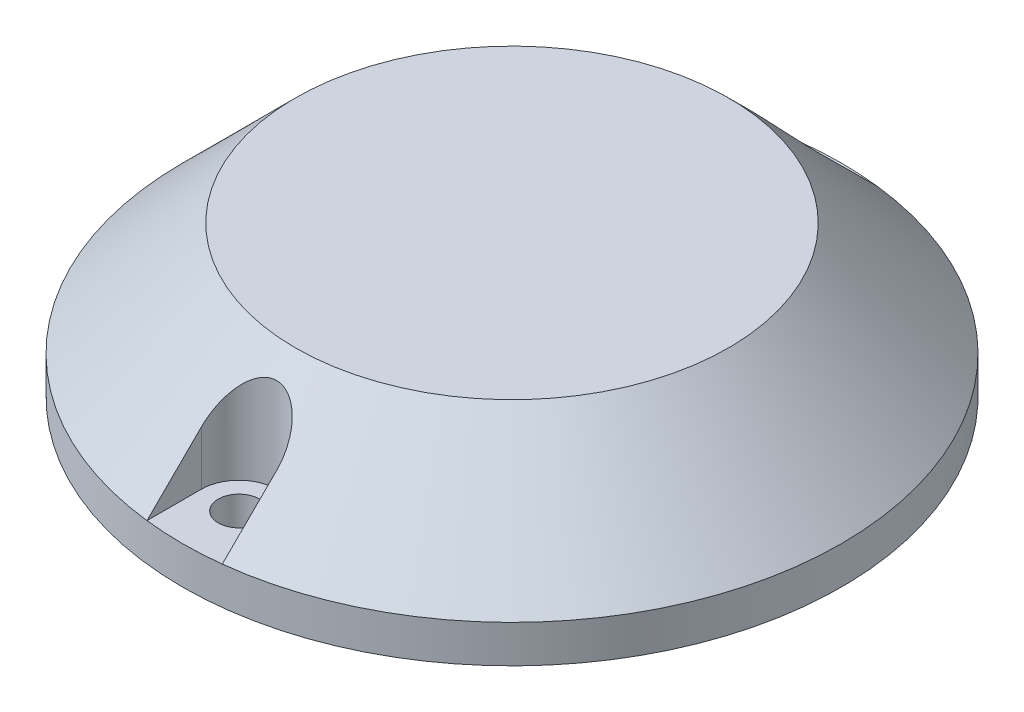
ISO-10303-21;
HEADER;
FILE_DESCRIPTION(('STEP AP214'),'2;1');
FILE_NAME('part.step','',(''),(''),'','','');
FILE_SCHEMA(('AUTOMOTIVE_DESIGN { 1 0 10303 214 1 1 1 1 }'));
ENDSEC;
DATA;
#1=APPLICATION_CONTEXT('core data for automotive mechanical design processes');
#2=APPLICATION_PROTOCOL_DEFINITION('international standard','automotive_design',2000,#1);
#3=PRODUCT_CONTEXT('',#1,'mechanical');
#4=PRODUCT('Part','Part','',(#3));
#5=PRODUCT_RELATED_PRODUCT_CATEGORY('part','',(#4));
#6=PRODUCT_DEFINITION_FORMATION('','',#4);
#7=PRODUCT_DEFINITION_CONTEXT('part definition',#1,'design');
#8=PRODUCT_DEFINITION('design','',#6,#7);
#9=PRODUCT_DEFINITION_SHAPE('','',#8);
#10=(LENGTH_UNIT() NAMED_UNIT(*) SI_UNIT(.MILLI.,.METRE.));
#11=(NAMED_UNIT(*) PLANE_ANGLE_UNIT() SI_UNIT($,.RADIAN.));
#12=(NAMED_UNIT(*) SI_UNIT($,.STERADIAN.) SOLID_ANGLE_UNIT());
#13=UNCERTAINTY_MEASURE_WITH_UNIT(LENGTH_MEASURE(1.E-05),#10,'distance_accuracy_value','');
#14=(GEOMETRIC_REPRESENTATION_CONTEXT(3) GLOBAL_UNCERTAINTY_ASSIGNED_CONTEXT((#13)) GLOBAL_UNIT_ASSIGNED_CONTEXT((#10,
#11,#12)) REPRESENTATION_CONTEXT('',''));
#15=CARTESIAN_POINT('',(0.,0.,0.));
#16=DIRECTION('',(0.,0.,1.));
#17=DIRECTION('',(1.,0.,0.));
#18=AXIS2_PLACEMENT_3D('',#15,#16,#17);
#19=CARTESIAN_POINT('',(0.,2.,14.5));
#20=DIRECTION('',(0.,-1.,0.));
#21=DIRECTION('',(0.,0.,-1.));
#22=AXIS2_PLACEMENT_3D('',#19,#20,#21);
#23=CYLINDRICAL_SURFACE('',#22,2.);
#24=CARTESIAN_POINT('',(0.,2.,14.5));
#25=DIRECTION('',(0.,-1.,0.));
#26=DIRECTION('',(0.,0.,-1.));
#27=AXIS2_PLACEMENT_3D('',#24,#25,#26);
#28=CIRCLE('',#27,2.);
#29=CARTESIAN_POINT('',(2.,2.,14.5));
#30=VERTEX_POINT('',#29);
#31=CARTESIAN_POINT('',(-2.,2.,14.5));
#32=VERTEX_POINT('',#31);
#33=EDGE_CURVE('E55',#30,#32,#28,.F.);
#34=ORIENTED_EDGE('',*,*,#33,.F.);
#35=DIRECTION('',(0.,-1.,0.));
#36=VECTOR('',#35,1.);
#37=CARTESIAN_POINT('',(2.,2.,14.5));
#38=LINE('',#37,#36);
#39=CARTESIAN_POINT('',(2.,4.86271883169562,14.5));
#40=VERTEX_POINT('',#39);
#41=EDGE_CURVE('E99',#40,#30,#38,.T.);
#42=ORIENTED_EDGE('',*,*,#41,.F.);
#43=CARTESIAN_POINT('',(2.,4.86271883169562,14.5));
#44=CARTESIAN_POINT('',(1.99997675343329,4.9407063679277,14.4212679489537));
#45=CARTESIAN_POINT('',(1.99535023705728,5.01901098737155,14.3428571380048));
#46=CARTESIAN_POINT('',(1.97694116800539,5.17578227500736,14.1871417479179));
#47=CARTESIAN_POINT('',(1.96315053181912,5.25424902524117,14.1098382070366));
#48=CARTESIAN_POINT('',(1.92628875434578,5.41148013636709,13.9562118483707));
#49=CARTESIAN_POINT('',(1.9031302247794,5.49024018078634,13.8799054514541));
#50=CARTESIAN_POINT('',(1.84742995490291,5.64661207060306,13.7296635568936));
#51=CARTESIAN_POINT('',(1.81489261304049,5.72422443633957,13.6557269658848));
#52=CARTESIAN_POINT('',(1.72278488749495,5.91328422099697,13.4771124547483));
#53=CARTESIAN_POINT('',(1.65767854615705,6.02369487984886,13.3741151805785));
#54=CARTESIAN_POINT('',(1.50542969733379,6.2369744024634,13.1774676947132));
#55=CARTESIAN_POINT('',(1.41836291824915,6.33986764793458,13.083786873342));
#56=CARTESIAN_POINT('',(1.25146131262373,6.50243323060851,12.937322221444));
#57=CARTESIAN_POINT('',(1.1780557708533,6.56547952830184,12.8809773757641));
#58=CARTESIAN_POINT('',(1.01931178866978,6.68298970102627,12.7766318825946));
#59=CARTESIAN_POINT('',(0.93398971376953,6.73746513223485,12.728619990536));
#60=CARTESIAN_POINT('',(0.772400968920876,6.82308865136111,12.6535405405875));
#61=CARTESIAN_POINT('',(0.698526214854478,6.85672242454555,12.6241942203136));
#62=CARTESIAN_POINT('',(0.544471315504831,6.91460573684364,12.5738382408308));
#63=CARTESIAN_POINT('',(0.464296218293099,6.93886269859673,12.5528219872452));
#64=CARTESIAN_POINT('',(0.298595863160995,6.97610959645531,12.5206024046663));
#65=CARTESIAN_POINT('',(0.213028899800128,6.98899602015913,12.5094892200129));
#66=CARTESIAN_POINT('',(0.0402300532613766,7.0016960635457,12.4985363398051));
#67=CARTESIAN_POINT('',(-0.0470005159210861,7.00151960553767,12.4986880876287));
#68=CARTESIAN_POINT('',(-0.207779439783227,6.9890796478216,12.5094174519238));
#69=CARTESIAN_POINT('',(-0.281564386338052,6.97847614552241,12.5185632200418));
#70=CARTESIAN_POINT('',(-0.425914432295378,6.94847760521361,12.5444996802881));
#71=CARTESIAN_POINT('',(-0.496478029268296,6.92907851015147,12.5612939003551));
#72=CARTESIAN_POINT('',(-0.653948767606214,6.87570769293482,12.6076501204024));
#73=CARTESIAN_POINT('',(-0.73926858946657,6.83909510996504,12.6395447575344));
#74=CARTESIAN_POINT('',(-0.900919440127082,6.75616004782281,12.7121976647588));
#75=CARTESIAN_POINT('',(-0.977233474591019,6.70981965547488,12.7529722920796));
#76=CARTESIAN_POINT('',(-1.15085918589485,6.58904592064706,12.8599224200133));
#77=CARTESIAN_POINT('',(-1.2434946113421,6.51099641084536,12.9295667574945));
#78=CARTESIAN_POINT('',(-1.41132920262807,6.34583074258239,13.078458869032));
#79=CARTESIAN_POINT('',(-1.48649058136265,6.25869551479957,13.1577269012111));
#80=CARTESIAN_POINT('',(-1.60114526282088,6.10487053072235,13.2991515358176));
#81=CARTESIAN_POINT('',(-1.6446650484717,6.03956513683104,13.3596179427855));
#82=CARTESIAN_POINT('',(-1.7239109204794,5.90690701820365,13.483371175306));
#83=CARTESIAN_POINT('',(-1.75963343421724,5.83955337101723,13.5466592778002));
#84=CARTESIAN_POINT('',(-1.85553143370052,5.63542310121361,13.7399337644359));
#85=CARTESIAN_POINT('',(-1.90449527879017,5.49649673749924,13.8734040790472));
#86=CARTESIAN_POINT('',(-1.9592696849247,5.27447768269675,14.0899528129197));
#87=CARTESIAN_POINT('',(-1.974540629402,5.1918152905621,14.1712874921419));
#88=CARTESIAN_POINT('',(-1.9948674393182,5.02690853588058,14.3349514420268));
#89=CARTESIAN_POINT('',(-1.9999657136124,4.94466386964872,14.4172751380618));
#90=CARTESIAN_POINT('',(-2.,4.86271883169562,14.5));
#91=B_SPLINE_CURVE_WITH_KNOTS('',3,(#43,#44,#45,#46,#47,#48,#49,#50,#51,#52,#53,#54,#55,#56,#57,
#58,#59,#60,#61,#62,#63,#64,#65,#66,#67,#68,#69,#70,#71,#72,#73,#74,#75,#76,#77,#78,#79,#80,#81,
#82,#83,#84,#85,#86,#87,#88,#89,#90),.UNSPECIFIED.,.F.,.F.,(4,2,2,2,2,2,2,2,2,2,2,2,2,2,2,2,2,2,
2,2,2,2,2,4),(0.,0.332352777438069,0.6649991073055,1.00082284399915,1.33648934259785,
1.82813850619722,2.31811490768561,2.65304936764591,2.98752828914008,3.24550934086806,
3.50328575577157,3.76338533783269,4.02328735537175,4.24756650352392,4.47194920801936,
4.76483515937641,5.05826524941971,5.47516346985609,5.89295500443999,6.18978891190359,
6.48675854102625,7.08033154594792,7.43086108173531,7.77992621562889),.UNSPECIFIED.);
#92=CARTESIAN_POINT('',(-2.,4.86271883169562,14.5));
#93=VERTEX_POINT('',#92);
#94=EDGE_CURVE('E113',#40,#93,#91,.T.);
#95=ORIENTED_EDGE('',*,*,#94,.T.);
#96=DIRECTION('',(0.,-1.,0.));
#97=VECTOR('',#96,1.);
#98=CARTESIAN_POINT('',(-2.,2.,14.5));
#99=LINE('',#98,#97);
#100=EDGE_CURVE('E148',#93,#32,#99,.T.);
#101=ORIENTED_EDGE('',*,*,#100,.T.);
#102=EDGE_LOOP('',(#34,#42,#95,#101));
#103=FACE_BOUND('',#102,.T.);
#104=ADVANCED_FACE('F39',(#103),#23,.F.);
#105=CARTESIAN_POINT('',(2.,2.,14.5));
#106=DIRECTION('',(1.,0.,0.));
#107=DIRECTION('',(0.,0.,-1.));
#108=AXIS2_PLACEMENT_3D('',#105,#106,#107);
#109=PLANE('',#108);
#110=DIRECTION('',(0.,0.,-1.));
#111=VECTOR('',#110,1.);
#112=CARTESIAN_POINT('',(2.,2.,14.5));
#113=LINE('',#112,#111);
#114=CARTESIAN_POINT('',(2.,2.,17.3853386507137));
#115=VERTEX_POINT('',#114);
#116=EDGE_CURVE('E94',#115,#30,#113,.T.);
#117=ORIENTED_EDGE('',*,*,#116,.F.);
#118=CARTESIAN_POINT('',(2.,2.,17.3853386507138));
#119=CARTESIAN_POINT('',(2.,2.23871552726578,17.1450482090425));
#120=CARTESIAN_POINT('',(2.,2.47739903699564,16.9047259539619));
#121=CARTESIAN_POINT('',(2.,2.95469205096368,16.4240080263002));
#122=CARTESIAN_POINT('',(2.,3.19330155521112,16.1836123537283));
#123=CARTESIAN_POINT('',(2.,3.6704366548449,15.7027377329102));
#124=CARTESIAN_POINT('',(2.,3.90896225022867,15.4622587846613));
#125=CARTESIAN_POINT('',(2.,4.38591650893731,14.9812047241831));
#126=CARTESIAN_POINT('',(2.,4.62434517225003,14.7406296119417));
#127=CARTESIAN_POINT('',(2.,4.86271883169562,14.5));
#128=B_SPLINE_CURVE_WITH_KNOTS('',3,(#118,#119,#120,#121,#122,#123,#124,#125,#126,#127),
.UNSPECIFIED.,.F.,.F.,(4,2,2,2,4),(0.,1.01613060158689,2.0322610760301,3.0483915815947,
4.0645222144758),.UNSPECIFIED.);
#129=EDGE_CURVE('E97',#115,#40,#128,.T.);
#130=ORIENTED_EDGE('',*,*,#129,.T.);
#131=ORIENTED_EDGE('',*,*,#41,.T.);
#132=EDGE_LOOP('',(#117,#130,#131));
#133=FACE_BOUND('',#132,.T.);
#134=ADVANCED_FACE('F96',(#133),#109,.F.);
#135=CARTESIAN_POINT('',(2.,2.,-14.5));
#136=DIRECTION('',(1.,0.,0.));
#137=DIRECTION('',(0.,0.,-1.));
#138=AXIS2_PLACEMENT_3D('',#135,#136,#137);
#139=PLANE('',#138);
#140=DIRECTION('',(0.,0.,-1.));
#141=VECTOR('',#140,1.);
#142=CARTESIAN_POINT('',(2.,2.,-14.5));
#143=LINE('',#142,#141);
#144=CARTESIAN_POINT('',(2.,2.,-14.5));
#145=VERTEX_POINT('',#144);
#146=CARTESIAN_POINT('',(2.,2.,-17.3853386507137));
#147=VERTEX_POINT('',#146);
#148=EDGE_CURVE('E63',#145,#147,#143,.T.);
#149=ORIENTED_EDGE('',*,*,#148,.F.);
#150=DIRECTION('',(0.,-1.,0.));
#151=VECTOR('',#150,1.);
#152=CARTESIAN_POINT('',(2.,2.,-14.5));
#153=LINE('',#152,#151);
#154=CARTESIAN_POINT('',(2.,4.86271883169562,-14.5));
#155=VERTEX_POINT('',#154);
#156=EDGE_CURVE('E155',#155,#145,#153,.T.);
#157=ORIENTED_EDGE('',*,*,#156,.F.);
#158=CARTESIAN_POINT('',(2.,4.86271883169562,-14.5));
#159=CARTESIAN_POINT('',(2.,4.62434517225003,-14.7406296119417));
#160=CARTESIAN_POINT('',(2.,4.38591650893731,-14.9812047241831));
#161=CARTESIAN_POINT('',(2.,3.90896225022867,-15.4622587846613));
#162=CARTESIAN_POINT('',(2.,3.6704366548449,-15.7027377329102));
#163=CARTESIAN_POINT('',(2.,3.19330155521112,-16.1836123537283));
#164=CARTESIAN_POINT('',(2.,2.95469205096368,-16.4240080263002));
#165=CARTESIAN_POINT('',(2.,2.47739903699564,-16.9047259539619));
#166=CARTESIAN_POINT('',(2.,2.23871552726578,-17.1450482090425));
#167=CARTESIAN_POINT('',(2.,2.,-17.3853386507138));
#168=B_SPLINE_CURVE_WITH_KNOTS('',3,(#158,#159,#160,#161,#162,#163,#164,#165,#166,#167),
.UNSPECIFIED.,.F.,.F.,(4,2,2,2,4),(0.,1.0161306328811,2.03226113844571,3.04839161288891,
4.0645222144758),.UNSPECIFIED.);
#169=EDGE_CURVE('E209',#155,#147,#168,.T.);
#170=ORIENTED_EDGE('',*,*,#169,.T.);
#171=EDGE_LOOP('',(#149,#157,#170));
#172=FACE_BOUND('',#171,.T.);
#173=ADVANCED_FACE('F219',(#172),#139,.F.);
#174=CARTESIAN_POINT('',(0.,2.,-14.5));
#175=DIRECTION('',(0.,-1.,0.));
#176=DIRECTION('',(0.,0.,-1.));
#177=AXIS2_PLACEMENT_3D('',#174,#175,#176);
#178=CYLINDRICAL_SURFACE('',#177,2.);
#179=CARTESIAN_POINT('',(0.,2.,-14.5));
#180=DIRECTION('',(0.,-1.,0.));
#181=DIRECTION('',(0.,0.,-1.));
#182=AXIS2_PLACEMENT_3D('',#179,#180,#181);
#183=CIRCLE('',#182,2.);
#184=CARTESIAN_POINT('',(-2.,2.,-14.5));
#185=VERTEX_POINT('',#184);
#186=EDGE_CURVE('E139',#185,#145,#183,.F.);
#187=ORIENTED_EDGE('',*,*,#186,.F.);
#188=DIRECTION('',(0.,-1.,0.));
#189=VECTOR('',#188,1.);
#190=CARTESIAN_POINT('',(-2.,2.,-14.5));
#191=LINE('',#190,#189);
#192=CARTESIAN_POINT('',(-2.,4.86271883169562,-14.5));
#193=VERTEX_POINT('',#192);
#194=EDGE_CURVE('E152',#193,#185,#191,.T.);
#195=ORIENTED_EDGE('',*,*,#194,.F.);
#196=CARTESIAN_POINT('',(-2.,4.86271883169562,-14.5));
#197=CARTESIAN_POINT('',(-1.99997675343329,4.9407063679277,-14.4212679489537));
#198=CARTESIAN_POINT('',(-1.99535023705728,5.01901098737155,-14.3428571380048));
#199=CARTESIAN_POINT('',(-1.97694116800539,5.17578227500736,-14.1871417479179));
#200=CARTESIAN_POINT('',(-1.96315053181912,5.25424902524117,-14.1098382070366));
#201=CARTESIAN_POINT('',(-1.92628875434578,5.41148013636709,-13.9562118483707));
#202=CARTESIAN_POINT('',(-1.9031302247794,5.49024018078634,-13.8799054514541));
#203=CARTESIAN_POINT('',(-1.84742995490291,5.64661207060306,-13.7296635568936));
#204=CARTESIAN_POINT('',(-1.81489261304049,5.72422443633957,-13.6557269658848));
#205=CARTESIAN_POINT('',(-1.72278488749495,5.91328422099697,-13.4771124547483));
#206=CARTESIAN_POINT('',(-1.65767854615705,6.02369487984886,-13.3741151805785));
#207=CARTESIAN_POINT('',(-1.50542969733379,6.2369744024634,-13.1774676947132));
#208=CARTESIAN_POINT('',(-1.41836291824915,6.33986764793458,-13.083786873342));
#209=CARTESIAN_POINT('',(-1.25146131262373,6.50243323060851,-12.937322221444));
#210=CARTESIAN_POINT('',(-1.1780557708533,6.56547952830184,-12.8809773757641));
#211=CARTESIAN_POINT('',(-1.01931178866978,6.68298970102627,-12.7766318825946));
#212=CARTESIAN_POINT('',(-0.93398971376953,6.73746513223485,-12.728619990536));
#213=CARTESIAN_POINT('',(-0.772400968920876,6.82308865136111,-12.6535405405875));
#214=CARTESIAN_POINT('',(-0.698526214854478,6.85672242454555,-12.6241942203136));
#215=CARTESIAN_POINT('',(-0.544471315504831,6.91460573684364,-12.5738382408308));
#216=CARTESIAN_POINT('',(-0.464296218293099,6.93886269859673,-12.5528219872452));
#217=CARTESIAN_POINT('',(-0.298595863160995,6.97610959645531,-12.5206024046663));
#218=CARTESIAN_POINT('',(-0.213028899800128,6.98899602015913,-12.5094892200129));
#219=CARTESIAN_POINT('',(-0.0402300532613766,7.0016960635457,-12.4985363398051));
#220=CARTESIAN_POINT('',(0.0470005159210861,7.00151960553767,-12.4986880876287));
#221=CARTESIAN_POINT('',(0.207779439783227,6.9890796478216,-12.5094174519238));
#222=CARTESIAN_POINT('',(0.281564386338052,6.97847614552241,-12.5185632200418));
#223=CARTESIAN_POINT('',(0.425914432295378,6.94847760521361,-12.5444996802881));
#224=CARTESIAN_POINT('',(0.496478029268296,6.92907851015147,-12.5612939003551));
#225=CARTESIAN_POINT('',(0.653948767606214,6.87570769293482,-12.6076501204024));
#226=CARTESIAN_POINT('',(0.73926858946657,6.83909510996504,-12.6395447575344));
#227=CARTESIAN_POINT('',(0.900919440127082,6.75616004782281,-12.7121976647588));
#228=CARTESIAN_POINT('',(0.977233474591019,6.70981965547488,-12.7529722920796));
#229=CARTESIAN_POINT('',(1.15085918589485,6.58904592064706,-12.8599224200133));
#230=CARTESIAN_POINT('',(1.2434946113421,6.51099641084536,-12.9295667574945));
#231=CARTESIAN_POINT('',(1.41132920262807,6.34583074258239,-13.078458869032));
#232=CARTESIAN_POINT('',(1.48649058136265,6.25869551479957,-13.1577269012111));
#233=CARTESIAN_POINT('',(1.60114526282088,6.10487053072235,-13.2991515358176));
#234=CARTESIAN_POINT('',(1.6446650484717,6.03956513683104,-13.3596179427855));
#235=CARTESIAN_POINT('',(1.7239109204794,5.90690701820365,-13.483371175306));
#236=CARTESIAN_POINT('',(1.75963343421724,5.83955337101723,-13.5466592778002));
#237=CARTESIAN_POINT('',(1.85553143370052,5.63542310121361,-13.7399337644359));
#238=CARTESIAN_POINT('',(1.90449527879017,5.49649673749924,-13.8734040790472));
#239=CARTESIAN_POINT('',(1.9592696849247,5.27447768269675,-14.0899528129197));
#240=CARTESIAN_POINT('',(1.974540629402,5.1918152905621,-14.1712874921419));
#241=CARTESIAN_POINT('',(1.9948674393182,5.02690853588058,-14.3349514420268));
#242=CARTESIAN_POINT('',(1.9999657136124,4.94466386964872,-14.4172751380618));
#243=CARTESIAN_POINT('',(2.,4.86271883169562,-14.5));
#244=B_SPLINE_CURVE_WITH_KNOTS('',3,(#196,#197,#198,#199,#200,#201,#202,#203,#204,#205,#206,
#207,#208,#209,#210,#211,#212,#213,#214,#215,#216,#217,#218,#219,#220,#221,#222,#223,#224,#225,
#226,#227,#228,#229,#230,#231,#232,#233,#234,#235,#236,#237,#238,#239,#240,#241,#242,#243),
.UNSPECIFIED.,.F.,.F.,(4,2,2,2,2,2,2,2,2,2,2,2,2,2,2,2,2,2,2,2,2,2,2,4),(0.,0.332352777438069,
0.6649991073055,1.00082284399915,1.33648934259785,1.82813850619722,2.31811490768561,
2.65304936764591,2.98752828914008,3.24550934086806,3.50328575577157,3.76338533783269,
4.02328735537175,4.24756650352392,4.47194920801936,4.76483515937641,5.05826524941971,
5.47516346985609,5.89295500443999,6.18978891190359,6.48675854102625,7.08033154594792,
7.43086108173531,7.77992621562889),.UNSPECIFIED.);
#245=EDGE_CURVE('E202',#193,#155,#244,.T.);
#246=ORIENTED_EDGE('',*,*,#245,.T.);
#247=ORIENTED_EDGE('',*,*,#156,.T.);
#248=EDGE_LOOP('',(#187,#195,#246,#247));
#249=FACE_BOUND('',#248,.T.);
#250=ADVANCED_FACE('F215',(#249),#178,.F.);
#251=CARTESIAN_POINT('',(-2.,2.,-14.5));
#252=DIRECTION('',(-1.,0.,0.));
#253=DIRECTION('',(0.,0.,1.));
#254=AXIS2_PLACEMENT_3D('',#251,#252,#253);
#255=PLANE('',#254);
#256=DIRECTION('',(0.,0.,1.));
#257=VECTOR('',#256,1.);
#258=CARTESIAN_POINT('',(-2.,2.,-14.5));
#259=LINE('',#258,#257);
#260=CARTESIAN_POINT('',(-1.99999999999999,2.,-17.3853386507137));
#261=VERTEX_POINT('',#260);
#262=EDGE_CURVE('E102',#261,#185,#259,.T.);
#263=ORIENTED_EDGE('',*,*,#262,.F.);
#264=CARTESIAN_POINT('',(-2.,2.,-17.3853386507138));
#265=CARTESIAN_POINT('',(-2.,2.23871552726578,-17.1450482090425));
#266=CARTESIAN_POINT('',(-2.,2.47739903699564,-16.9047259539619));
#267=CARTESIAN_POINT('',(-2.,2.95469205096368,-16.4240080263002));
#268=CARTESIAN_POINT('',(-2.,3.19330155521112,-16.1836123537283));
#269=CARTESIAN_POINT('',(-2.,3.6704366548449,-15.7027377329102));
#270=CARTESIAN_POINT('',(-2.,3.90896225022867,-15.4622587846613));
#271=CARTESIAN_POINT('',(-2.,4.38591650893731,-14.9812047241831));
#272=CARTESIAN_POINT('',(-2.,4.62434517225003,-14.7406296119417));
#273=CARTESIAN_POINT('',(-2.,4.86271883169562,-14.5));
#274=B_SPLINE_CURVE_WITH_KNOTS('',3,(#264,#265,#266,#267,#268,#269,#270,#271,#272,#273),
.UNSPECIFIED.,.F.,.F.,(4,2,2,2,4),(0.,1.01613060158689,2.0322610760301,3.0483915815947,
4.0645222144758),.UNSPECIFIED.);
#275=EDGE_CURVE('E195',#261,#193,#274,.T.);
#276=ORIENTED_EDGE('',*,*,#275,.T.);
#277=ORIENTED_EDGE('',*,*,#194,.T.);
#278=EDGE_LOOP('',(#263,#276,#277));
#279=FACE_BOUND('',#278,.T.);
#280=ADVANCED_FACE('F218',(#279),#255,.F.);
#281=CARTESIAN_POINT('',(-2.,2.,14.5));
#282=DIRECTION('',(-1.,0.,0.));
#283=DIRECTION('',(0.,0.,1.));
#284=AXIS2_PLACEMENT_3D('',#281,#282,#283);
#285=PLANE('',#284);
#286=DIRECTION('',(0.,0.,1.));
#287=VECTOR('',#286,1.);
#288=CARTESIAN_POINT('',(-2.,2.,14.5));
#289=LINE('',#288,#287);
#290=CARTESIAN_POINT('',(-2.,2.,17.3853386507137));
#291=VERTEX_POINT('',#290);
#292=EDGE_CURVE('E128',#32,#291,#289,.T.);
#293=ORIENTED_EDGE('',*,*,#292,.F.);
#294=ORIENTED_EDGE('',*,*,#100,.F.);
#295=CARTESIAN_POINT('',(-2.,4.86271883169562,14.5));
#296=CARTESIAN_POINT('',(-2.,4.62434517225003,14.7406296119417));
#297=CARTESIAN_POINT('',(-2.,4.38591650893731,14.9812047241831));
#298=CARTESIAN_POINT('',(-2.,3.90896225022867,15.4622587846613));
#299=CARTESIAN_POINT('',(-2.,3.6704366548449,15.7027377329102));
#300=CARTESIAN_POINT('',(-2.,3.19330155521112,16.1836123537283));
#301=CARTESIAN_POINT('',(-2.,2.95469205096368,16.4240080263002));
#302=CARTESIAN_POINT('',(-2.,2.47739903699564,16.9047259539619));
#303=CARTESIAN_POINT('',(-2.,2.23871552726578,17.1450482090425));
#304=CARTESIAN_POINT('',(-2.,2.,17.3853386507138));
#305=B_SPLINE_CURVE_WITH_KNOTS('',3,(#295,#296,#297,#298,#299,#300,#301,#302,#303,#304),
.UNSPECIFIED.,.F.,.F.,(4,2,2,2,4),(0.,1.0161306328811,2.03226113844571,3.04839161288891,
4.0645222144758),.UNSPECIFIED.);
#306=EDGE_CURVE('E188',#93,#291,#305,.T.);
#307=ORIENTED_EDGE('',*,*,#306,.T.);
#308=EDGE_LOOP('',(#293,#294,#307));
#309=FACE_BOUND('',#308,.T.);
#310=ADVANCED_FACE('F255',(#309),#285,.F.);
#311=CARTESIAN_POINT('',(0.,2.,0.));
#312=DIRECTION('',(0.,-1.,0.));
#313=DIRECTION('',(0.,0.,-1.));
#314=AXIS2_PLACEMENT_3D('',#311,#312,#313);
#315=CYLINDRICAL_SURFACE('',#314,17.5);
#316=CARTESIAN_POINT('',(0.,0.,0.));
#317=DIRECTION('',(0.,1.,0.));
#318=DIRECTION('',(0.,0.,1.));
#319=AXIS2_PLACEMENT_3D('',#316,#317,#318);
#320=CIRCLE('',#319,17.5);
#321=CARTESIAN_POINT('',(0.,0.,17.5));
#322=VERTEX_POINT('',#321);
#323=EDGE_CURVE('E124',#322,#322,#320,.T.);
#324=ORIENTED_EDGE('',*,*,#323,.T.);
#325=EDGE_LOOP('',(#324));
#326=FACE_BOUND('',#325,.T.);
#327=CARTESIAN_POINT('',(0.,2.,0.));
#328=DIRECTION('',(0.,1.,0.));
#329=DIRECTION('',(0.,0.,1.));
#330=AXIS2_PLACEMENT_3D('',#327,#328,#329);
#331=CIRCLE('',#330,17.5);
#332=EDGE_CURVE('E110',#115,#147,#331,.T.);
#333=ORIENTED_EDGE('',*,*,#332,.F.);
#334=CARTESIAN_POINT('',(0.,2.,0.));
#335=DIRECTION('',(0.,-1.,0.));
#336=DIRECTION('',(0.,0.,-1.));
#337=AXIS2_PLACEMENT_3D('',#334,#335,#336);
#338=CIRCLE('',#337,17.5);
#339=EDGE_CURVE('E120',#115,#291,#338,.T.);
#340=ORIENTED_EDGE('',*,*,#339,.T.);
#341=CARTESIAN_POINT('',(0.,2.,0.));
#342=DIRECTION('',(0.,1.,0.));
#343=DIRECTION('',(0.,0.,1.));
#344=AXIS2_PLACEMENT_3D('',#341,#342,#343);
#345=CIRCLE('',#344,17.5);
#346=EDGE_CURVE('E123',#261,#291,#345,.T.);
#347=ORIENTED_EDGE('',*,*,#346,.F.);
#348=EDGE_CURVE('E122',#261,#147,#338,.T.);
#349=ORIENTED_EDGE('',*,*,#348,.T.);
#350=EDGE_LOOP('',(#333,#340,#347,#349));
#351=FACE_BOUND('',#350,.T.);
#352=ADVANCED_FACE('F118',(#326,#351),#315,.T.);
#353=CARTESIAN_POINT('',(0.,0.,14.5));
#354=DIRECTION('',(0.,1.,0.));
#355=DIRECTION('',(0.,0.,1.));
#356=AXIS2_PLACEMENT_3D('',#353,#354,#355);
#357=PLANE('',#356);
#358=CARTESIAN_POINT('',(0.,0.,0.));
#359=DIRECTION('',(0.,1.,0.));
#360=DIRECTION('',(0.,0.,1.));
#361=AXIS2_PLACEMENT_3D('',#358,#359,#360);
#362=CIRCLE('',#361,12.5);
#363=CARTESIAN_POINT('',(0.,0.,12.5));
#364=VERTEX_POINT('',#363);
#365=EDGE_CURVE('E11',#364,#364,#362,.T.);
#366=ORIENTED_EDGE('',*,*,#365,.T.);
#367=EDGE_LOOP('',(#366));
#368=FACE_BOUND('',#367,.T.);
#369=ORIENTED_EDGE('',*,*,#323,.F.);
#370=EDGE_LOOP('',(#369));
#371=FACE_BOUND('',#370,.T.);
#372=CARTESIAN_POINT('',(0.,0.,14.5));
#373=DIRECTION('',(0.,-1.,0.));
#374=DIRECTION('',(0.,0.,-1.));
#375=AXIS2_PLACEMENT_3D('',#372,#373,#374);
#376=CIRCLE('',#375,1.1);
#377=CARTESIAN_POINT('',(0.,0.,13.4));
#378=VERTEX_POINT('',#377);
#379=EDGE_CURVE('E133',#378,#378,#376,.T.);
#380=ORIENTED_EDGE('',*,*,#379,.F.);
#381=EDGE_LOOP('',(#380));
#382=FACE_BOUND('',#381,.T.);
#383=CARTESIAN_POINT('',(0.,0.,-14.5));
#384=DIRECTION('',(0.,-1.,0.));
#385=DIRECTION('',(0.,0.,-1.));
#386=AXIS2_PLACEMENT_3D('',#383,#384,#385);
#387=CIRCLE('',#386,1.1);
#388=CARTESIAN_POINT('',(0.,0.,-15.6));
#389=VERTEX_POINT('',#388);
#390=EDGE_CURVE('E452',#389,#389,#387,.T.);
#391=ORIENTED_EDGE('',*,*,#390,.F.);
#392=EDGE_LOOP('',(#391));
#393=FACE_BOUND('',#392,.T.);
#394=ADVANCED_FACE('F273',(#368,#371,#382,#393),#357,.F.);
#395=CARTESIAN_POINT('',(0.,8.,0.));
#396=DIRECTION('',(0.,1.,0.));
#397=DIRECTION('',(0.,0.,1.));
#398=AXIS2_PLACEMENT_3D('',#395,#396,#397);
#399=PLANE('',#398);
#400=CARTESIAN_POINT('',(0.,8.,0.));
#401=DIRECTION('',(0.,1.,0.));
#402=DIRECTION('',(0.,0.,1.));
#403=AXIS2_PLACEMENT_3D('',#400,#401,#402);
#404=CIRCLE('',#403,11.5);
#405=CARTESIAN_POINT('',(0.,8.,11.5));
#406=VERTEX_POINT('',#405);
#407=EDGE_CURVE('E143',#406,#406,#404,.T.);
#408=ORIENTED_EDGE('',*,*,#407,.T.);
#409=EDGE_LOOP('',(#408));
#410=FACE_BOUND('',#409,.T.);
#411=ADVANCED_FACE('F179',(#410),#399,.T.);
#412=CARTESIAN_POINT('',(0.,8.0000000000001,0.));
#413=DIRECTION('',(0.,-1.,0.));
#414=DIRECTION('',(0.,0.,-1.));
#415=AXIS2_PLACEMENT_3D('',#412,#413,#414);
#416=CONICAL_SURFACE('',#415,11.5,0.785398163397443);
#417=ORIENTED_EDGE('',*,*,#129,.F.);
#418=ORIENTED_EDGE('',*,*,#332,.T.);
#419=ORIENTED_EDGE('',*,*,#169,.F.);
#420=ORIENTED_EDGE('',*,*,#245,.F.);
#421=ORIENTED_EDGE('',*,*,#275,.F.);
#422=ORIENTED_EDGE('',*,*,#346,.T.);
#423=ORIENTED_EDGE('',*,*,#306,.F.);
#424=ORIENTED_EDGE('',*,*,#94,.F.);
#425=EDGE_LOOP('',(#417,#418,#419,#420,#421,#422,#423,#424));
#426=FACE_BOUND('',#425,.T.);
#427=ORIENTED_EDGE('',*,*,#407,.F.);
#428=EDGE_LOOP('',(#427));
#429=FACE_BOUND('',#428,.T.);
#430=ADVANCED_FACE('F107',(#426,#429),#416,.T.);
#431=CARTESIAN_POINT('',(0.,2.,14.5));
#432=DIRECTION('',(0.,-1.,0.));
#433=DIRECTION('',(0.,0.,-1.));
#434=AXIS2_PLACEMENT_3D('',#431,#432,#433);
#435=CYLINDRICAL_SURFACE('',#434,1.1);
#436=CARTESIAN_POINT('',(0.,2.,14.5));
#437=DIRECTION('',(0.,-1.,0.));
#438=DIRECTION('',(0.,0.,-1.));
#439=AXIS2_PLACEMENT_3D('',#436,#437,#438);
#440=CIRCLE('',#439,1.1);
#441=CARTESIAN_POINT('',(0.,2.,13.4));
#442=VERTEX_POINT('',#441);
#443=EDGE_CURVE('E131',#442,#442,#440,.T.);
#444=ORIENTED_EDGE('',*,*,#443,.F.);
#445=EDGE_LOOP('',(#444));
#446=FACE_BOUND('',#445,.T.);
#447=ORIENTED_EDGE('',*,*,#379,.T.);
#448=EDGE_LOOP('',(#447));
#449=FACE_BOUND('',#448,.T.);
#450=ADVANCED_FACE('F178',(#446,#449),#435,.F.);
#451=CARTESIAN_POINT('',(0.,2.,0.));
#452=DIRECTION('',(0.,-1.,0.));
#453=DIRECTION('',(0.,0.,-1.));
#454=AXIS2_PLACEMENT_3D('',#451,#452,#453);
#455=PLANE('',#454);
#456=ORIENTED_EDGE('',*,*,#443,.T.);
#457=EDGE_LOOP('',(#456));
#458=FACE_BOUND('',#457,.T.);
#459=ORIENTED_EDGE('',*,*,#339,.F.);
#460=ORIENTED_EDGE('',*,*,#116,.T.);
#461=ORIENTED_EDGE('',*,*,#33,.T.);
#462=ORIENTED_EDGE('',*,*,#292,.T.);
#463=EDGE_LOOP('',(#459,#460,#461,#462));
#464=FACE_BOUND('',#463,.T.);
#465=ADVANCED_FACE('F127',(#458,#464),#455,.F.);
#466=CARTESIAN_POINT('',(0.,2.,-14.5));
#467=DIRECTION('',(0.,-1.,0.));
#468=DIRECTION('',(0.,0.,-1.));
#469=AXIS2_PLACEMENT_3D('',#466,#467,#468);
#470=CIRCLE('',#469,1.1);
#471=CARTESIAN_POINT('',(0.,2.,-15.6));
#472=VERTEX_POINT('',#471);
#473=EDGE_CURVE('E454',#472,#472,#470,.T.);
#474=ORIENTED_EDGE('',*,*,#473,.T.);
#475=EDGE_LOOP('',(#474));
#476=FACE_BOUND('',#475,.T.);
#477=ORIENTED_EDGE('',*,*,#186,.T.);
#478=ORIENTED_EDGE('',*,*,#148,.T.);
#479=ORIENTED_EDGE('',*,*,#348,.F.);
#480=ORIENTED_EDGE('',*,*,#262,.T.);
#481=EDGE_LOOP('',(#477,#478,#479,#480));
#482=FACE_BOUND('',#481,.T.);
#483=ADVANCED_FACE('F303',(#476,#482),#455,.F.);
#484=CARTESIAN_POINT('',(0.,2.,-14.5));
#485=DIRECTION('',(0.,-1.,0.));
#486=DIRECTION('',(0.,0.,-1.));
#487=AXIS2_PLACEMENT_3D('',#484,#485,#486);
#488=CYLINDRICAL_SURFACE('',#487,1.1);
#489=ORIENTED_EDGE('',*,*,#473,.F.);
#490=EDGE_LOOP('',(#489));
#491=FACE_BOUND('',#490,.T.);
#492=ORIENTED_EDGE('',*,*,#390,.T.);
#493=EDGE_LOOP('',(#492));
#494=FACE_BOUND('',#493,.T.);
#495=ADVANCED_FACE('F314',(#491,#494),#488,.F.);
#496=CARTESIAN_POINT('',(0.,7.,0.));
#497=DIRECTION('',(0.,-1.,0.));
#498=DIRECTION('',(0.,0.,-1.));
#499=AXIS2_PLACEMENT_3D('',#496,#497,#498);
#500=CYLINDRICAL_SURFACE('',#499,11.5);
#501=CARTESIAN_POINT('',(0.,1.00000000000002,0.));
#502=DIRECTION('',(0.,1.,0.));
#503=DIRECTION('',(0.,0.,1.));
#504=AXIS2_PLACEMENT_3D('',#501,#502,#503);
#505=CIRCLE('',#504,11.5);
#506=CARTESIAN_POINT('',(0.,1.00000000000002,11.5));
#507=VERTEX_POINT('',#506);
#508=EDGE_CURVE('E48',#507,#507,#505,.F.);
#509=ORIENTED_EDGE('',*,*,#508,.T.);
#510=EDGE_LOOP('',(#509));
#511=FACE_BOUND('',#510,.T.);
#512=CARTESIAN_POINT('',(0.,5.5,0.));
#513=DIRECTION('',(0.,-1.,0.));
#514=DIRECTION('',(0.,0.,-1.));
#515=AXIS2_PLACEMENT_3D('',#512,#513,#514);
#516=CIRCLE('',#515,11.5);
#517=CARTESIAN_POINT('',(0.,5.5,-11.5));
#518=VERTEX_POINT('',#517);
#519=EDGE_CURVE('E431',#518,#518,#516,.F.);
#520=ORIENTED_EDGE('',*,*,#519,.T.);
#521=EDGE_LOOP('',(#520));
#522=FACE_BOUND('',#521,.T.);
#523=ADVANCED_FACE('F324',(#511,#522),#500,.F.);
#524=CARTESIAN_POINT('',(0.,7.,0.));
#525=DIRECTION('',(0.,-1.,0.));
#526=DIRECTION('',(0.,0.,-1.));
#527=AXIS2_PLACEMENT_3D('',#524,#525,#526);
#528=PLANE('',#527);
#529=CARTESIAN_POINT('',(0.,7.,0.));
#530=DIRECTION('',(0.,-1.,0.));
#531=DIRECTION('',(0.,0.,-1.));
#532=AXIS2_PLACEMENT_3D('',#529,#530,#531);
#533=CIRCLE('',#532,9.99999999999999);
#534=CARTESIAN_POINT('',(0.,7.,-9.99999999999999));
#535=VERTEX_POINT('',#534);
#536=EDGE_CURVE('E433',#535,#535,#533,.T.);
#537=ORIENTED_EDGE('',*,*,#536,.T.);
#538=EDGE_LOOP('',(#537));
#539=FACE_BOUND('',#538,.T.);
#540=ADVANCED_FACE('F333',(#539),#528,.T.);
#541=CARTESIAN_POINT('',(0.,7.,0.));
#542=DIRECTION('',(0.,-1.,0.));
#543=DIRECTION('',(0.,0.,-1.));
#544=AXIS2_PLACEMENT_3D('',#541,#542,#543);
#545=CONICAL_SURFACE('',#544,9.99999999999999,0.785398163397453);
#546=CARTESIAN_POINT('',(0.,5.5,-11.5));
#547=CARTESIAN_POINT('',(0.,5.515625,-11.484375));
#548=CARTESIAN_POINT('',(0.,5.53125,-11.46875));
#549=CARTESIAN_POINT('',(0.,5.5625,-11.4375));
#550=CARTESIAN_POINT('',(0.,5.578125,-11.421875));
#551=CARTESIAN_POINT('',(0.,5.609375,-11.390625));
#552=CARTESIAN_POINT('',(0.,5.625,-11.375));
#553=CARTESIAN_POINT('',(0.,5.65625,-11.34375));
#554=CARTESIAN_POINT('',(0.,5.671875,-11.328125));
#555=CARTESIAN_POINT('',(0.,5.703125,-11.296875));
#556=CARTESIAN_POINT('',(0.,5.71875,-11.28125));
#557=CARTESIAN_POINT('',(0.,5.75,-11.25));
#558=CARTESIAN_POINT('',(0.,5.765625,-11.234375));
#559=CARTESIAN_POINT('',(0.,5.796875,-11.203125));
#560=CARTESIAN_POINT('',(0.,5.8125,-11.1875));
#561=CARTESIAN_POINT('',(0.,5.84375,-11.15625));
#562=CARTESIAN_POINT('',(0.,5.859375,-11.140625));
#563=CARTESIAN_POINT('',(0.,5.890625,-11.109375));
#564=CARTESIAN_POINT('',(0.,5.90625,-11.09375));
#565=CARTESIAN_POINT('',(0.,5.9375,-11.0625));
#566=CARTESIAN_POINT('',(0.,5.953125,-11.046875));
#567=CARTESIAN_POINT('',(0.,5.984375,-11.015625));
#568=CARTESIAN_POINT('',(0.,6.,-11.));
#569=CARTESIAN_POINT('',(0.,6.03125,-10.96875));
#570=CARTESIAN_POINT('',(0.,6.046875,-10.953125));
#571=CARTESIAN_POINT('',(0.,6.078125,-10.921875));
#572=CARTESIAN_POINT('',(0.,6.09375,-10.90625));
#573=CARTESIAN_POINT('',(0.,6.125,-10.875));
#574=CARTESIAN_POINT('',(0.,6.140625,-10.859375));
#575=CARTESIAN_POINT('',(0.,6.171875,-10.828125));
#576=CARTESIAN_POINT('',(0.,6.1875,-10.8125));
#577=CARTESIAN_POINT('',(0.,6.21875,-10.78125));
#578=CARTESIAN_POINT('',(0.,6.234375,-10.765625));
#579=CARTESIAN_POINT('',(0.,6.265625,-10.734375));
#580=CARTESIAN_POINT('',(0.,6.28125,-10.71875));
#581=CARTESIAN_POINT('',(0.,6.3125,-10.6875));
#582=CARTESIAN_POINT('',(0.,6.328125,-10.671875));
#583=CARTESIAN_POINT('',(0.,6.359375,-10.640625));
#584=CARTESIAN_POINT('',(0.,6.375,-10.625));
#585=CARTESIAN_POINT('',(0.,6.40625,-10.59375));
#586=CARTESIAN_POINT('',(0.,6.421875,-10.578125));
#587=CARTESIAN_POINT('',(0.,6.453125,-10.546875));
#588=CARTESIAN_POINT('',(0.,6.46875,-10.53125));
#589=CARTESIAN_POINT('',(0.,6.5,-10.5));
#590=CARTESIAN_POINT('',(0.,6.515625,-10.484375));
#591=CARTESIAN_POINT('',(0.,6.546875,-10.453125));
#592=CARTESIAN_POINT('',(0.,6.5625,-10.4375));
#593=CARTESIAN_POINT('',(0.,6.59375,-10.40625));
#594=CARTESIAN_POINT('',(0.,6.609375,-10.390625));
#595=CARTESIAN_POINT('',(0.,6.640625,-10.359375));
#596=CARTESIAN_POINT('',(0.,6.65625,-10.34375));
#597=CARTESIAN_POINT('',(0.,6.6875,-10.3125));
#598=CARTESIAN_POINT('',(0.,6.703125,-10.296875));
#599=CARTESIAN_POINT('',(0.,6.734375,-10.265625));
#600=CARTESIAN_POINT('',(0.,6.75,-10.25));
#601=CARTESIAN_POINT('',(0.,6.78125,-10.21875));
#602=CARTESIAN_POINT('',(0.,6.796875,-10.203125));
#603=CARTESIAN_POINT('',(0.,6.828125,-10.171875));
#604=CARTESIAN_POINT('',(0.,6.84375,-10.15625));
#605=CARTESIAN_POINT('',(0.,6.875,-10.125));
#606=CARTESIAN_POINT('',(0.,6.890625,-10.109375));
#607=CARTESIAN_POINT('',(0.,6.921875,-10.078125));
#608=CARTESIAN_POINT('',(0.,6.9375,-10.0625));
#609=CARTESIAN_POINT('',(0.,6.96875,-10.03125));
#610=CARTESIAN_POINT('',(0.,6.984375,-10.015625));
#611=CARTESIAN_POINT('',(0.,7.,-9.99999999999999));
#612=B_SPLINE_CURVE_WITH_KNOTS('',3,(#546,#547,#548,#549,#550,#551,#552,#553,#554,#555,#556,
#557,#558,#559,#560,#561,#562,#563,#564,#565,#566,#567,#568,#569,#570,#571,#572,#573,#574,#575,
#576,#577,#578,#579,#580,#581,#582,#583,#584,#585,#586,#587,#588,#589,#590,#591,#592,#593,#594,
#595,#596,#597,#598,#599,#600,#601,#602,#603,#604,#605,#606,#607,#608,#609,#610,#611),
.UNSPECIFIED.,.F.,.F.,(4,2,2,2,2,2,2,2,2,2,2,2,2,2,2,2,2,2,2,2,2,2,2,2,2,2,2,2,2,2,2,2,4),(0.,
0.0662912607362389,0.132582521472478,0.198873782208718,0.265165042944956,0.331456303681195,
0.397747564417434,0.464038825153673,0.530330085889913,0.596621346626152,0.662912607362391,
0.729203868098629,0.795495128834868,0.861786389571108,0.928077650307347,0.994368911043585,
1.06066017177982,1.12695143251606,1.1932426932523,1.25953395398854,1.32582521472478,
1.39211647546102,1.45840773619726,1.5246989969335,1.59099025766974,1.65728151840598,
1.72357277914221,1.78986403987845,1.85615530061469,1.92244656135093,1.98873782208717,
2.05502908282341,2.12132034355965),.UNSPECIFIED.);
#613=EDGE_CURVE('BSEAM181',#518,#535,#612,.T.);
#614=ORIENTED_EDGE('',*,*,#519,.F.);
#615=ORIENTED_EDGE('',*,*,#536,.F.);
#616=ORIENTED_EDGE('',*,*,#613,.T.);
#617=ORIENTED_EDGE('',*,*,#613,.F.);
#618=EDGE_LOOP('',(#614,#616,#615,#617));
#619=FACE_BOUND('',#618,.T.);
#620=ADVANCED_FACE('F181',(#619),#545,.F.);
#621=CARTESIAN_POINT('',(0.,1.00000000000002,0.));
#622=DIRECTION('',(0.,-1.,0.));
#623=DIRECTION('',(0.,0.,-1.));
#624=AXIS2_PLACEMENT_3D('',#621,#622,#623);
#625=CONICAL_SURFACE('',#624,11.5,0.785398163397449);
#626=ORIENTED_EDGE('',*,*,#365,.F.);
#627=EDGE_LOOP('',(#626));
#628=FACE_BOUND('',#627,.T.);
#629=ORIENTED_EDGE('',*,*,#508,.F.);
#630=EDGE_LOOP('',(#629));
#631=FACE_BOUND('',#630,.T.);
#632=ADVANCED_FACE('F42',(#628,#631),#625,.F.);
#633=CLOSED_SHELL('',(#104,#134,#173,#250,#280,#310,#352,#394,#411,#430,#450,#465,#483,#495,
#523,#540,#620,#632));
#634=MANIFOLD_SOLID_BREP('B2',#633);
#635=ADVANCED_BREP_SHAPE_REPRESENTATION('',(#18,#634),#14);
#636=SHAPE_DEFINITION_REPRESENTATION(#9,#635);
ENDSEC;
END-ISO-10303-21;
